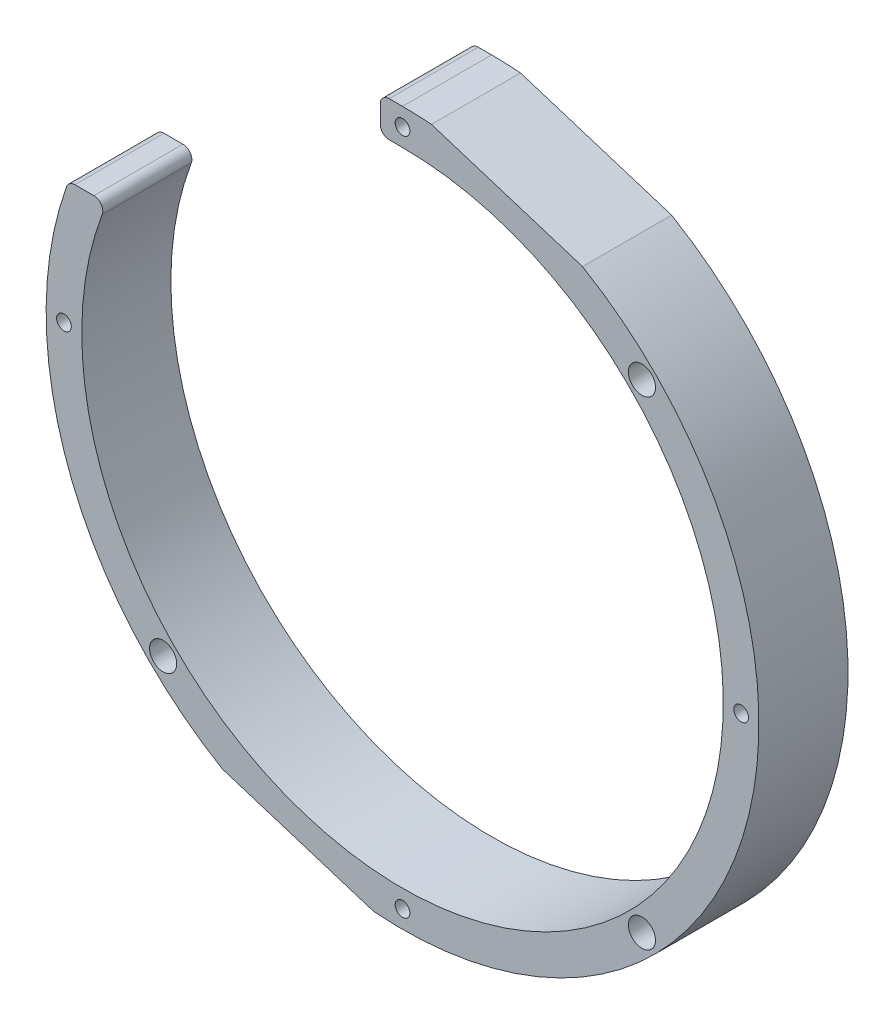
ISO-10303-21;
HEADER;
FILE_DESCRIPTION(('STEP AP214'),'2;1');
FILE_NAME('part.step','',(''),(''),'','','');
FILE_SCHEMA(('AUTOMOTIVE_DESIGN { 1 0 10303 214 1 1 1 1 }'));
ENDSEC;
DATA;
#1=APPLICATION_CONTEXT('core data for automotive mechanical design processes');
#2=APPLICATION_PROTOCOL_DEFINITION('international standard','automotive_design',2000,#1);
#3=PRODUCT_CONTEXT('',#1,'mechanical');
#4=PRODUCT('Part','Part','',(#3));
#5=PRODUCT_RELATED_PRODUCT_CATEGORY('part','',(#4));
#6=PRODUCT_DEFINITION_FORMATION('','',#4);
#7=PRODUCT_DEFINITION_CONTEXT('part definition',#1,'design');
#8=PRODUCT_DEFINITION('design','',#6,#7);
#9=PRODUCT_DEFINITION_SHAPE('','',#8);
#10=(LENGTH_UNIT() NAMED_UNIT(*) SI_UNIT(.MILLI.,.METRE.));
#11=(NAMED_UNIT(*) PLANE_ANGLE_UNIT() SI_UNIT($,.RADIAN.));
#12=(NAMED_UNIT(*) SI_UNIT($,.STERADIAN.) SOLID_ANGLE_UNIT());
#13=UNCERTAINTY_MEASURE_WITH_UNIT(LENGTH_MEASURE(1.E-05),#10,'distance_accuracy_value','');
#14=(GEOMETRIC_REPRESENTATION_CONTEXT(3) GLOBAL_UNCERTAINTY_ASSIGNED_CONTEXT((#13)) GLOBAL_UNIT_ASSIGNED_CONTEXT((#10,
#11,#12)) REPRESENTATION_CONTEXT('',''));
#15=CARTESIAN_POINT('',(0.,0.,0.));
#16=DIRECTION('',(0.,0.,1.));
#17=DIRECTION('',(1.,0.,0.));
#18=AXIS2_PLACEMENT_3D('',#15,#16,#17);
#19=CARTESIAN_POINT('',(0.,0.,20.));
#20=DIRECTION('',(0.,0.,-1.));
#21=DIRECTION('',(-1.,0.,0.));
#22=AXIS2_PLACEMENT_3D('',#19,#20,#21);
#23=CYLINDRICAL_SURFACE('',#22,80.);
#24=CARTESIAN_POINT('',(0.,0.,20.));
#25=DIRECTION('',(0.,0.,1.));
#26=DIRECTION('',(1.,0.,0.));
#27=AXIS2_PLACEMENT_3D('',#24,#25,#26);
#28=CIRCLE('',#27,80.);
#29=CARTESIAN_POINT('',(-6.48259589782646,-79.7369171113699,20.));
#30=VERTEX_POINT('',#29);
#31=CARTESIAN_POINT('',(40.3924041021735,69.0539911290196,20.));
#32=VERTEX_POINT('',#31);
#33=EDGE_CURVE('E154',#30,#32,#28,.T.);
#34=ORIENTED_EDGE('',*,*,#33,.F.);
#35=DIRECTION('',(0.,0.,-1.));
#36=VECTOR('',#35,1.);
#37=CARTESIAN_POINT('',(-6.48259589782646,-79.7369171113699,20.));
#38=LINE('',#37,#36);
#39=CARTESIAN_POINT('',(-6.48259589782646,-79.7369171113699,0.));
#40=VERTEX_POINT('',#39);
#41=EDGE_CURVE('E11',#30,#40,#38,.T.);
#42=ORIENTED_EDGE('',*,*,#41,.T.);
#43=CARTESIAN_POINT('',(0.,0.,0.));
#44=DIRECTION('',(0.,0.,1.));
#45=DIRECTION('',(1.,0.,0.));
#46=AXIS2_PLACEMENT_3D('',#43,#44,#45);
#47=CIRCLE('',#46,80.);
#48=CARTESIAN_POINT('',(40.3924041021735,69.0539911290196,0.));
#49=VERTEX_POINT('',#48);
#50=EDGE_CURVE('E164',#40,#49,#47,.T.);
#51=ORIENTED_EDGE('',*,*,#50,.T.);
#52=DIRECTION('',(0.,0.,-1.));
#53=VECTOR('',#52,1.);
#54=CARTESIAN_POINT('',(40.3924041021735,69.0539911290196,20.));
#55=LINE('',#54,#53);
#56=EDGE_CURVE('E144',#49,#32,#55,.F.);
#57=ORIENTED_EDGE('',*,*,#56,.T.);
#58=EDGE_LOOP('',(#34,#42,#51,#57));
#59=FACE_BOUND('',#58,.T.);
#60=ADVANCED_FACE('F38',(#59),#23,.T.);
#61=CARTESIAN_POINT('',(6.48259589782654,79.7369171113699,20.));
#62=VERTEX_POINT('',#61);
#63=CARTESIAN_POINT('',(0.,80.,20.));
#64=VERTEX_POINT('',#63);
#65=EDGE_CURVE('E151',#62,#64,#28,.T.);
#66=ORIENTED_EDGE('',*,*,#65,.F.);
#67=DIRECTION('',(0.,0.,-1.));
#68=VECTOR('',#67,1.);
#69=CARTESIAN_POINT('',(6.48259589782654,79.7369171113699,20.));
#70=LINE('',#69,#68);
#71=CARTESIAN_POINT('',(6.48259589782659,79.7369171113699,0.));
#72=VERTEX_POINT('',#71);
#73=EDGE_CURVE('E137',#62,#72,#70,.T.);
#74=ORIENTED_EDGE('',*,*,#73,.T.);
#75=CARTESIAN_POINT('',(0.,80.,0.));
#76=VERTEX_POINT('',#75);
#77=EDGE_CURVE('E166',#72,#76,#47,.T.);
#78=ORIENTED_EDGE('',*,*,#77,.T.);
#79=DIRECTION('',(0.,0.,1.));
#80=VECTOR('',#79,1.);
#81=CARTESIAN_POINT('',(0.,80.,0.));
#82=LINE('',#81,#80);
#83=EDGE_CURVE('E159',#76,#64,#82,.T.);
#84=ORIENTED_EDGE('',*,*,#83,.T.);
#85=EDGE_LOOP('',(#66,#74,#78,#84));
#86=FACE_BOUND('',#85,.T.);
#87=ADVANCED_FACE('F157',(#86),#23,.T.);
#88=CARTESIAN_POINT('',(0.,0.,20.));
#89=DIRECTION('',(0.,0.,1.));
#90=DIRECTION('',(1.,0.,0.));
#91=AXIS2_PLACEMENT_3D('',#88,#89,#90);
#92=PLANE('',#91);
#93=DIRECTION('',(-0.95378787333583,0.30048076923077,0.));
#94=VECTOR('',#93,1.);
#95=CARTESIAN_POINT('',(6.86909386117425,-83.9432255804466,20.));
#96=LINE('',#95,#94);
#97=CARTESIAN_POINT('',(-40.3924041021737,-69.0539911290195,20.));
#98=VERTEX_POINT('',#97);
#99=EDGE_CURVE('E61',#30,#98,#96,.T.);
#100=ORIENTED_EDGE('',*,*,#99,.F.);
#101=ORIENTED_EDGE('',*,*,#33,.T.);
#102=DIRECTION('',(0.95378787333583,-0.300480769230769,0.));
#103=VECTOR('',#102,1.);
#104=CARTESIAN_POINT('',(-8.2717714259117,84.3851242933763,20.));
#105=LINE('',#104,#103);
#106=EDGE_CURVE('E53',#62,#32,#105,.T.);
#107=ORIENTED_EDGE('',*,*,#106,.F.);
#108=ORIENTED_EDGE('',*,*,#65,.T.);
#109=DIRECTION('',(-1.,0.,0.));
#110=VECTOR('',#109,1.);
#111=CARTESIAN_POINT('',(0.,80.,20.));
#112=LINE('',#111,#110);
#113=CARTESIAN_POINT('',(-3.,80.,20.));
#114=VERTEX_POINT('',#113);
#115=EDGE_CURVE('E250',#64,#114,#112,.T.);
#116=ORIENTED_EDGE('',*,*,#115,.T.);
#117=CARTESIAN_POINT('',(-3.,78.,20.));
#118=DIRECTION('',(0.,0.,1.));
#119=DIRECTION('',(1.,0.,0.));
#120=AXIS2_PLACEMENT_3D('',#117,#118,#119);
#121=CIRCLE('',#120,2.);
#122=CARTESIAN_POINT('',(-5.,78.,20.));
#123=VERTEX_POINT('',#122);
#124=EDGE_CURVE('E195',#114,#123,#121,.T.);
#125=ORIENTED_EDGE('',*,*,#124,.T.);
#126=DIRECTION('',(0.,-1.,0.));
#127=VECTOR('',#126,1.);
#128=CARTESIAN_POINT('',(-5.,72.,20.));
#129=LINE('',#128,#127);
#130=CARTESIAN_POINT('',(-5.,74.,20.));
#131=VERTEX_POINT('',#130);
#132=EDGE_CURVE('E280',#123,#131,#129,.T.);
#133=ORIENTED_EDGE('',*,*,#132,.T.);
#134=CARTESIAN_POINT('',(-3.,74.,20.));
#135=DIRECTION('',(0.,0.,1.));
#136=DIRECTION('',(1.,0.,0.));
#137=AXIS2_PLACEMENT_3D('',#134,#135,#136);
#138=CIRCLE('',#137,2.);
#139=CARTESIAN_POINT('',(-3.,72.,20.));
#140=VERTEX_POINT('',#139);
#141=EDGE_CURVE('E193',#131,#140,#138,.T.);
#142=ORIENTED_EDGE('',*,*,#141,.T.);
#143=DIRECTION('',(1.,0.,0.));
#144=VECTOR('',#143,1.);
#145=CARTESIAN_POINT('',(-2.51386656396706E-13,72.,20.));
#146=LINE('',#145,#144);
#147=CARTESIAN_POINT('',(-2.51386656396706E-13,72.,20.));
#148=VERTEX_POINT('',#147);
#149=EDGE_CURVE('E275',#140,#148,#146,.T.);
#150=ORIENTED_EDGE('',*,*,#149,.T.);
#151=CARTESIAN_POINT('',(0.,0.,20.));
#152=DIRECTION('',(0.,0.,1.));
#153=DIRECTION('',(1.,0.,0.));
#154=AXIS2_PLACEMENT_3D('',#151,#152,#153);
#155=CIRCLE('',#154,72.);
#156=CARTESIAN_POINT('',(-67.4095449432212,25.2972972972973,20.));
#157=VERTEX_POINT('',#156);
#158=EDGE_CURVE('E294',#157,#148,#155,.T.);
#159=ORIENTED_EDGE('',*,*,#158,.F.);
#160=CARTESIAN_POINT('',(-69.2820323027551,26.,20.));
#161=DIRECTION('',(0.,0.,1.));
#162=DIRECTION('',(1.,0.,0.));
#163=AXIS2_PLACEMENT_3D('',#160,#161,#162);
#164=CIRCLE('',#163,2.);
#165=CARTESIAN_POINT('',(-69.2820323027551,28.,20.));
#166=VERTEX_POINT('',#165);
#167=EDGE_CURVE('E199',#157,#166,#164,.T.);
#168=ORIENTED_EDGE('',*,*,#167,.T.);
#169=DIRECTION('',(1.,0.,0.));
#170=VECTOR('',#169,1.);
#171=CARTESIAN_POINT('',(0.,28.,20.));
#172=LINE('',#171,#170);
#173=CARTESIAN_POINT('',(-73.5391052434009,28.,20.));
#174=VERTEX_POINT('',#173);
#175=EDGE_CURVE('E286',#174,#166,#172,.T.);
#176=ORIENTED_EDGE('',*,*,#175,.F.);
#177=CARTESIAN_POINT('',(-73.5391052434009,26.,20.));
#178=DIRECTION('',(0.,0.,1.));
#179=DIRECTION('',(1.,0.,0.));
#180=AXIS2_PLACEMENT_3D('',#177,#178,#179);
#181=CIRCLE('',#180,2.);
#182=CARTESIAN_POINT('',(-75.4247233265651,26.6666666666666,20.));
#183=VERTEX_POINT('',#182);
#184=EDGE_CURVE('E197',#174,#183,#181,.T.);
#185=ORIENTED_EDGE('',*,*,#184,.T.);
#186=EDGE_CURVE('E162',#183,#98,#28,.T.);
#187=ORIENTED_EDGE('',*,*,#186,.T.);
#188=EDGE_LOOP('',(#100,#101,#107,#108,#116,#125,#133,#142,#150,#159,#168,#176,#185,#187));
#189=FACE_BOUND('',#188,.T.);
#190=CARTESIAN_POINT('',(53.7401153701777,53.7401153701775,20.));
#191=DIRECTION('',(0.,0.,1.));
#192=DIRECTION('',(1.,0.,0.));
#193=AXIS2_PLACEMENT_3D('',#190,#191,#192);
#194=CIRCLE('',#193,3.05);
#195=CARTESIAN_POINT('',(56.7901153701777,53.7401153701775,20.));
#196=VERTEX_POINT('',#195);
#197=EDGE_CURVE('E218',#196,#196,#194,.T.);
#198=ORIENTED_EDGE('',*,*,#197,.F.);
#199=EDGE_LOOP('',(#198));
#200=FACE_BOUND('',#199,.T.);
#201=CARTESIAN_POINT('',(53.7401153701773,-53.7401153701779,20.));
#202=DIRECTION('',(0.,0.,1.));
#203=DIRECTION('',(1.,0.,0.));
#204=AXIS2_PLACEMENT_3D('',#201,#202,#203);
#205=CIRCLE('',#204,3.04999999999999);
#206=CARTESIAN_POINT('',(56.7901153701773,-53.7401153701779,20.));
#207=VERTEX_POINT('',#206);
#208=EDGE_CURVE('E239',#207,#207,#205,.T.);
#209=ORIENTED_EDGE('',*,*,#208,.F.);
#210=EDGE_LOOP('',(#209));
#211=FACE_BOUND('',#210,.T.);
#212=CARTESIAN_POINT('',(-53.7401153701762,-53.740115370179,20.));
#213=DIRECTION('',(0.,0.,1.));
#214=DIRECTION('',(-1.,0.,0.));
#215=AXIS2_PLACEMENT_3D('',#212,#213,#214);
#216=CIRCLE('',#215,3.04999999999999);
#217=CARTESIAN_POINT('',(-56.7901153701762,-53.740115370179,20.));
#218=VERTEX_POINT('',#217);
#219=EDGE_CURVE('E236',#218,#218,#216,.T.);
#220=ORIENTED_EDGE('',*,*,#219,.F.);
#221=EDGE_LOOP('',(#220));
#222=FACE_BOUND('',#221,.T.);
#223=CARTESIAN_POINT('',(-76.0000000000001,-8.10674255934108E-13,20.));
#224=DIRECTION('',(0.,0.,1.));
#225=DIRECTION('',(1.,0.,0.));
#226=AXIS2_PLACEMENT_3D('',#223,#224,#225);
#227=CIRCLE('',#226,1.65);
#228=CARTESIAN_POINT('',(-74.3500000000001,-8.10674255934108E-13,20.));
#229=VERTEX_POINT('',#228);
#230=EDGE_CURVE('E251',#229,#229,#227,.T.);
#231=ORIENTED_EDGE('',*,*,#230,.F.);
#232=EDGE_LOOP('',(#231));
#233=FACE_BOUND('',#232,.T.);
#234=CARTESIAN_POINT('',(0.,-76.0000000000001,20.));
#235=DIRECTION('',(0.,0.,1.));
#236=DIRECTION('',(1.,0.,0.));
#237=AXIS2_PLACEMENT_3D('',#234,#235,#236);
#238=CIRCLE('',#237,1.65);
#239=CARTESIAN_POINT('',(1.65000000000008,-76.0000000000001,20.));
#240=VERTEX_POINT('',#239);
#241=EDGE_CURVE('E257',#240,#240,#238,.T.);
#242=ORIENTED_EDGE('',*,*,#241,.F.);
#243=EDGE_LOOP('',(#242));
#244=FACE_BOUND('',#243,.T.);
#245=CARTESIAN_POINT('',(76.0000000000001,3.34243238210584E-13,20.));
#246=DIRECTION('',(0.,0.,1.));
#247=DIRECTION('',(1.,0.,0.));
#248=AXIS2_PLACEMENT_3D('',#245,#246,#247);
#249=CIRCLE('',#248,1.65);
#250=CARTESIAN_POINT('',(77.65,3.34243238210584E-13,20.));
#251=VERTEX_POINT('',#250);
#252=EDGE_CURVE('E263',#251,#251,#249,.T.);
#253=ORIENTED_EDGE('',*,*,#252,.F.);
#254=EDGE_LOOP('',(#253));
#255=FACE_BOUND('',#254,.T.);
#256=CARTESIAN_POINT('',(-5.75070603216809E-13,76.0000000000001,20.));
#257=DIRECTION('',(0.,0.,1.));
#258=DIRECTION('',(1.,0.,0.));
#259=AXIS2_PLACEMENT_3D('',#256,#257,#258);
#260=CIRCLE('',#259,1.65);
#261=CARTESIAN_POINT('',(1.64999999999942,76.0000000000001,20.));
#262=VERTEX_POINT('',#261);
#263=EDGE_CURVE('E224',#262,#262,#260,.T.);
#264=ORIENTED_EDGE('',*,*,#263,.F.);
#265=EDGE_LOOP('',(#264));
#266=FACE_BOUND('',#265,.T.);
#267=ADVANCED_FACE('F148',(#189,#200,#211,#222,#233,#244,#255,#266),#92,.T.);
#268=CARTESIAN_POINT('',(0.,0.,0.));
#269=DIRECTION('',(0.,0.,1.));
#270=DIRECTION('',(1.,0.,0.));
#271=AXIS2_PLACEMENT_3D('',#268,#269,#270);
#272=PLANE('',#271);
#273=CARTESIAN_POINT('',(53.7401153701777,53.7401153701775,0.));
#274=DIRECTION('',(0.,0.,1.));
#275=DIRECTION('',(1.,0.,0.));
#276=AXIS2_PLACEMENT_3D('',#273,#274,#275);
#277=CIRCLE('',#276,3.05);
#278=CARTESIAN_POINT('',(56.7901153701777,53.7401153701775,0.));
#279=VERTEX_POINT('',#278);
#280=EDGE_CURVE('E221',#279,#279,#277,.T.);
#281=ORIENTED_EDGE('',*,*,#280,.T.);
#282=EDGE_LOOP('',(#281));
#283=FACE_BOUND('',#282,.T.);
#284=CARTESIAN_POINT('',(53.7401153701773,-53.7401153701779,0.));
#285=DIRECTION('',(0.,0.,1.));
#286=DIRECTION('',(1.,0.,0.));
#287=AXIS2_PLACEMENT_3D('',#284,#285,#286);
#288=CIRCLE('',#287,3.04999999999999);
#289=CARTESIAN_POINT('',(56.7901153701773,-53.7401153701779,0.));
#290=VERTEX_POINT('',#289);
#291=EDGE_CURVE('E217',#290,#290,#288,.T.);
#292=ORIENTED_EDGE('',*,*,#291,.T.);
#293=EDGE_LOOP('',(#292));
#294=FACE_BOUND('',#293,.T.);
#295=CARTESIAN_POINT('',(-53.7401153701762,-53.740115370179,0.));
#296=DIRECTION('',(0.,0.,1.));
#297=DIRECTION('',(1.,0.,0.));
#298=AXIS2_PLACEMENT_3D('',#295,#296,#297);
#299=CIRCLE('',#298,3.04999999999999);
#300=CARTESIAN_POINT('',(-50.6901153701762,-53.740115370179,0.));
#301=VERTEX_POINT('',#300);
#302=EDGE_CURVE('E214',#301,#301,#299,.T.);
#303=ORIENTED_EDGE('',*,*,#302,.T.);
#304=EDGE_LOOP('',(#303));
#305=FACE_BOUND('',#304,.T.);
#306=CARTESIAN_POINT('',(-76.0000000000001,-8.10674255934108E-13,0.));
#307=DIRECTION('',(0.,0.,1.));
#308=DIRECTION('',(1.,0.,0.));
#309=AXIS2_PLACEMENT_3D('',#306,#307,#308);
#310=CIRCLE('',#309,1.65);
#311=CARTESIAN_POINT('',(-74.3500000000001,-8.10674255934108E-13,0.));
#312=VERTEX_POINT('',#311);
#313=EDGE_CURVE('E247',#312,#312,#310,.T.);
#314=ORIENTED_EDGE('',*,*,#313,.T.);
#315=EDGE_LOOP('',(#314));
#316=FACE_BOUND('',#315,.T.);
#317=CARTESIAN_POINT('',(0.,-76.0000000000001,0.));
#318=DIRECTION('',(0.,0.,1.));
#319=DIRECTION('',(1.,0.,0.));
#320=AXIS2_PLACEMENT_3D('',#317,#318,#319);
#321=CIRCLE('',#320,1.65);
#322=CARTESIAN_POINT('',(1.65000000000008,-76.0000000000001,0.));
#323=VERTEX_POINT('',#322);
#324=EDGE_CURVE('E254',#323,#323,#321,.T.);
#325=ORIENTED_EDGE('',*,*,#324,.T.);
#326=EDGE_LOOP('',(#325));
#327=FACE_BOUND('',#326,.T.);
#328=CARTESIAN_POINT('',(76.0000000000001,3.34243238210584E-13,0.));
#329=DIRECTION('',(0.,0.,1.));
#330=DIRECTION('',(1.,0.,0.));
#331=AXIS2_PLACEMENT_3D('',#328,#329,#330);
#332=CIRCLE('',#331,1.65);
#333=CARTESIAN_POINT('',(77.65,3.34243238210584E-13,0.));
#334=VERTEX_POINT('',#333);
#335=EDGE_CURVE('E260',#334,#334,#332,.T.);
#336=ORIENTED_EDGE('',*,*,#335,.T.);
#337=EDGE_LOOP('',(#336));
#338=FACE_BOUND('',#337,.T.);
#339=CARTESIAN_POINT('',(-5.75070603216809E-13,76.0000000000001,0.));
#340=DIRECTION('',(0.,0.,1.));
#341=DIRECTION('',(1.,0.,0.));
#342=AXIS2_PLACEMENT_3D('',#339,#340,#341);
#343=CIRCLE('',#342,1.65);
#344=CARTESIAN_POINT('',(1.64999999999942,76.0000000000001,0.));
#345=VERTEX_POINT('',#344);
#346=EDGE_CURVE('E266',#345,#345,#343,.T.);
#347=ORIENTED_EDGE('',*,*,#346,.T.);
#348=EDGE_LOOP('',(#347));
#349=FACE_BOUND('',#348,.T.);
#350=ORIENTED_EDGE('',*,*,#50,.F.);
#351=DIRECTION('',(-0.95378787333583,0.30048076923077,0.));
#352=VECTOR('',#351,1.);
#353=CARTESIAN_POINT('',(-23.4375000000001,-74.3954541201947,0.));
#354=LINE('',#353,#352);
#355=CARTESIAN_POINT('',(-40.3924041021736,-69.0539911290195,0.));
#356=VERTEX_POINT('',#355);
#357=EDGE_CURVE('E231',#40,#356,#354,.T.);
#358=ORIENTED_EDGE('',*,*,#357,.T.);
#359=CARTESIAN_POINT('',(-75.4247233265651,26.6666666666666,0.));
#360=VERTEX_POINT('',#359);
#361=EDGE_CURVE('E160',#360,#356,#47,.T.);
#362=ORIENTED_EDGE('',*,*,#361,.F.);
#363=CARTESIAN_POINT('',(-73.5391052434009,26.,0.));
#364=DIRECTION('',(0.,0.,1.));
#365=DIRECTION('',(1.,0.,0.));
#366=AXIS2_PLACEMENT_3D('',#363,#364,#365);
#367=CIRCLE('',#366,2.);
#368=CARTESIAN_POINT('',(-73.5391052434009,28.,0.));
#369=VERTEX_POINT('',#368);
#370=EDGE_CURVE('E187',#360,#369,#367,.F.);
#371=ORIENTED_EDGE('',*,*,#370,.T.);
#372=DIRECTION('',(1.,0.,0.));
#373=VECTOR('',#372,1.);
#374=CARTESIAN_POINT('',(0.,28.,0.));
#375=LINE('',#374,#373);
#376=CARTESIAN_POINT('',(-69.2820323027551,28.,0.));
#377=VERTEX_POINT('',#376);
#378=EDGE_CURVE('E287',#369,#377,#375,.T.);
#379=ORIENTED_EDGE('',*,*,#378,.T.);
#380=CARTESIAN_POINT('',(-69.2820323027551,26.,0.));
#381=DIRECTION('',(0.,0.,1.));
#382=DIRECTION('',(1.,0.,0.));
#383=AXIS2_PLACEMENT_3D('',#380,#381,#382);
#384=CIRCLE('',#383,2.);
#385=CARTESIAN_POINT('',(-67.4095449432212,25.2972972972973,0.));
#386=VERTEX_POINT('',#385);
#387=EDGE_CURVE('E189',#377,#386,#384,.F.);
#388=ORIENTED_EDGE('',*,*,#387,.T.);
#389=CARTESIAN_POINT('',(0.,0.,0.));
#390=DIRECTION('',(0.,0.,1.));
#391=DIRECTION('',(1.,0.,0.));
#392=AXIS2_PLACEMENT_3D('',#389,#390,#391);
#393=CIRCLE('',#392,72.);
#394=CARTESIAN_POINT('',(-2.51386656396706E-13,72.,0.));
#395=VERTEX_POINT('',#394);
#396=EDGE_CURVE('E293',#386,#395,#393,.T.);
#397=ORIENTED_EDGE('',*,*,#396,.T.);
#398=DIRECTION('',(-1.,0.,0.));
#399=VECTOR('',#398,1.);
#400=CARTESIAN_POINT('',(-2.51386656396706E-13,72.,0.));
#401=LINE('',#400,#399);
#402=CARTESIAN_POINT('',(-3.,72.,0.));
#403=VERTEX_POINT('',#402);
#404=EDGE_CURVE('E274',#395,#403,#401,.T.);
#405=ORIENTED_EDGE('',*,*,#404,.T.);
#406=CARTESIAN_POINT('',(-3.,74.,0.));
#407=DIRECTION('',(0.,0.,1.));
#408=DIRECTION('',(1.,0.,0.));
#409=AXIS2_PLACEMENT_3D('',#406,#407,#408);
#410=CIRCLE('',#409,2.);
#411=CARTESIAN_POINT('',(-5.,74.,0.));
#412=VERTEX_POINT('',#411);
#413=EDGE_CURVE('E183',#403,#412,#410,.F.);
#414=ORIENTED_EDGE('',*,*,#413,.T.);
#415=DIRECTION('',(0.,1.,0.));
#416=VECTOR('',#415,1.);
#417=CARTESIAN_POINT('',(-5.,72.,0.));
#418=LINE('',#417,#416);
#419=CARTESIAN_POINT('',(-5.,78.,0.));
#420=VERTEX_POINT('',#419);
#421=EDGE_CURVE('E271',#412,#420,#418,.T.);
#422=ORIENTED_EDGE('',*,*,#421,.T.);
#423=CARTESIAN_POINT('',(-3.,78.,0.));
#424=DIRECTION('',(0.,0.,1.));
#425=DIRECTION('',(1.,0.,0.));
#426=AXIS2_PLACEMENT_3D('',#423,#424,#425);
#427=CIRCLE('',#426,2.);
#428=CARTESIAN_POINT('',(-3.,80.,0.));
#429=VERTEX_POINT('',#428);
#430=EDGE_CURVE('E185',#420,#429,#427,.F.);
#431=ORIENTED_EDGE('',*,*,#430,.T.);
#432=DIRECTION('',(1.,0.,0.));
#433=VECTOR('',#432,1.);
#434=CARTESIAN_POINT('',(0.,80.,0.));
#435=LINE('',#434,#433);
#436=EDGE_CURVE('E278',#429,#76,#435,.T.);
#437=ORIENTED_EDGE('',*,*,#436,.T.);
#438=ORIENTED_EDGE('',*,*,#77,.F.);
#439=DIRECTION('',(0.95378787333583,-0.300480769230769,0.));
#440=VECTOR('',#439,1.);
#441=CARTESIAN_POINT('',(23.4375,74.3954541201948,0.));
#442=LINE('',#441,#440);
#443=EDGE_CURVE('E140',#72,#49,#442,.T.);
#444=ORIENTED_EDGE('',*,*,#443,.T.);
#445=EDGE_LOOP('',(#350,#358,#362,#371,#379,#388,#397,#405,#414,#422,#431,#437,#438,#444));
#446=FACE_BOUND('',#445,.T.);
#447=ADVANCED_FACE('F234',(#283,#294,#305,#316,#327,#338,#349,#446),#272,.F.);
#448=ORIENTED_EDGE('',*,*,#361,.T.);
#449=DIRECTION('',(0.,0.,-1.));
#450=VECTOR('',#449,1.);
#451=CARTESIAN_POINT('',(-40.3924041021736,-69.0539911290195,20.));
#452=LINE('',#451,#450);
#453=EDGE_CURVE('E46',#356,#98,#452,.F.);
#454=ORIENTED_EDGE('',*,*,#453,.T.);
#455=ORIENTED_EDGE('',*,*,#186,.F.);
#456=DIRECTION('',(0.,0.,-1.));
#457=VECTOR('',#456,1.);
#458=CARTESIAN_POINT('',(-75.4247233265651,26.6666666666666,20.));
#459=LINE('',#458,#457);
#460=EDGE_CURVE('E201',#183,#360,#459,.T.);
#461=ORIENTED_EDGE('',*,*,#460,.T.);
#462=EDGE_LOOP('',(#448,#454,#455,#461));
#463=FACE_BOUND('',#462,.T.);
#464=ADVANCED_FACE('F226',(#463),#23,.T.);
#465=CARTESIAN_POINT('',(0.,0.,20.));
#466=DIRECTION('',(0.,0.,-1.));
#467=DIRECTION('',(-1.,0.,0.));
#468=AXIS2_PLACEMENT_3D('',#465,#466,#467);
#469=CYLINDRICAL_SURFACE('',#468,72.);
#470=ORIENTED_EDGE('',*,*,#396,.F.);
#471=DIRECTION('',(0.,0.,-1.));
#472=VECTOR('',#471,1.);
#473=CARTESIAN_POINT('',(-67.4095449432212,25.2972972972973,20.));
#474=LINE('',#473,#472);
#475=EDGE_CURVE('E191',#386,#157,#474,.F.);
#476=ORIENTED_EDGE('',*,*,#475,.T.);
#477=ORIENTED_EDGE('',*,*,#158,.T.);
#478=DIRECTION('',(0.,0.,-1.));
#479=VECTOR('',#478,1.);
#480=CARTESIAN_POINT('',(0.,72.,20.));
#481=LINE('',#480,#479);
#482=EDGE_CURVE('E169',#395,#148,#481,.F.);
#483=ORIENTED_EDGE('',*,*,#482,.F.);
#484=EDGE_LOOP('',(#470,#476,#477,#483));
#485=FACE_BOUND('',#484,.T.);
#486=ADVANCED_FACE('F302',(#485),#469,.F.);
#487=CARTESIAN_POINT('',(0.,28.,0.));
#488=DIRECTION('',(0.,-1.,0.));
#489=DIRECTION('',(1.,0.,0.));
#490=AXIS2_PLACEMENT_3D('',#487,#488,#489);
#491=PLANE('',#490);
#492=ORIENTED_EDGE('',*,*,#175,.T.);
#493=DIRECTION('',(0.,0.,1.));
#494=VECTOR('',#493,1.);
#495=CARTESIAN_POINT('',(-69.2820323027551,28.,0.));
#496=LINE('',#495,#494);
#497=EDGE_CURVE('E178',#166,#377,#496,.F.);
#498=ORIENTED_EDGE('',*,*,#497,.T.);
#499=ORIENTED_EDGE('',*,*,#378,.F.);
#500=DIRECTION('',(0.,0.,-1.));
#501=VECTOR('',#500,1.);
#502=CARTESIAN_POINT('',(-73.5391052434009,28.,0.));
#503=LINE('',#502,#501);
#504=EDGE_CURVE('E172',#369,#174,#503,.F.);
#505=ORIENTED_EDGE('',*,*,#504,.T.);
#506=EDGE_LOOP('',(#492,#498,#499,#505));
#507=FACE_BOUND('',#506,.T.);
#508=ADVANCED_FACE('F311',(#507),#491,.F.);
#509=CARTESIAN_POINT('',(-2.51386656396706E-13,72.,-9.4339811320566));
#510=DIRECTION('',(0.,-1.,0.));
#511=DIRECTION('',(0.,0.,-1.));
#512=AXIS2_PLACEMENT_3D('',#509,#510,#511);
#513=PLANE('',#512);
#514=ORIENTED_EDGE('',*,*,#149,.F.);
#515=DIRECTION('',(0.,0.,1.));
#516=VECTOR('',#515,1.);
#517=CARTESIAN_POINT('',(-3.,72.,-9.4339811320566));
#518=LINE('',#517,#516);
#519=EDGE_CURVE('E212',#140,#403,#518,.F.);
#520=ORIENTED_EDGE('',*,*,#519,.T.);
#521=ORIENTED_EDGE('',*,*,#404,.F.);
#522=ORIENTED_EDGE('',*,*,#482,.T.);
#523=EDGE_LOOP('',(#514,#520,#521,#522));
#524=FACE_BOUND('',#523,.T.);
#525=ADVANCED_FACE('F300',(#524),#513,.T.);
#526=CARTESIAN_POINT('',(-5.,72.,-9.4339811320566));
#527=DIRECTION('',(-1.,0.,0.));
#528=DIRECTION('',(0.,-1.,0.));
#529=AXIS2_PLACEMENT_3D('',#526,#527,#528);
#530=PLANE('',#529);
#531=ORIENTED_EDGE('',*,*,#132,.F.);
#532=DIRECTION('',(0.,0.,1.));
#533=VECTOR('',#532,1.);
#534=CARTESIAN_POINT('',(-5.,78.,-9.4339811320566));
#535=LINE('',#534,#533);
#536=EDGE_CURVE('E210',#123,#420,#535,.F.);
#537=ORIENTED_EDGE('',*,*,#536,.T.);
#538=ORIENTED_EDGE('',*,*,#421,.F.);
#539=DIRECTION('',(0.,0.,1.));
#540=VECTOR('',#539,1.);
#541=CARTESIAN_POINT('',(-5.,74.,-9.4339811320566));
#542=LINE('',#541,#540);
#543=EDGE_CURVE('E207',#412,#131,#542,.T.);
#544=ORIENTED_EDGE('',*,*,#543,.T.);
#545=EDGE_LOOP('',(#531,#537,#538,#544));
#546=FACE_BOUND('',#545,.T.);
#547=ADVANCED_FACE('F350',(#546),#530,.T.);
#548=CARTESIAN_POINT('',(0.,80.,-9.4339811320566));
#549=DIRECTION('',(0.,1.,0.));
#550=DIRECTION('',(0.,0.,1.));
#551=AXIS2_PLACEMENT_3D('',#548,#549,#550);
#552=PLANE('',#551);
#553=ORIENTED_EDGE('',*,*,#436,.F.);
#554=DIRECTION('',(0.,0.,1.));
#555=VECTOR('',#554,1.);
#556=CARTESIAN_POINT('',(-3.,80.,-9.4339811320566));
#557=LINE('',#556,#555);
#558=EDGE_CURVE('E204',#429,#114,#557,.T.);
#559=ORIENTED_EDGE('',*,*,#558,.T.);
#560=ORIENTED_EDGE('',*,*,#115,.F.);
#561=ORIENTED_EDGE('',*,*,#83,.F.);
#562=EDGE_LOOP('',(#553,#559,#560,#561));
#563=FACE_BOUND('',#562,.T.);
#564=ADVANCED_FACE('F324',(#563),#552,.T.);
#565=CARTESIAN_POINT('',(-69.2820323027551,26.,20.));
#566=DIRECTION('',(0.,0.,-1.));
#567=DIRECTION('',(-1.,0.,0.));
#568=AXIS2_PLACEMENT_3D('',#565,#566,#567);
#569=CYLINDRICAL_SURFACE('',#568,2.);
#570=ORIENTED_EDGE('',*,*,#167,.F.);
#571=ORIENTED_EDGE('',*,*,#475,.F.);
#572=ORIENTED_EDGE('',*,*,#387,.F.);
#573=ORIENTED_EDGE('',*,*,#497,.F.);
#574=EDGE_LOOP('',(#570,#571,#572,#573));
#575=FACE_BOUND('',#574,.T.);
#576=ADVANCED_FACE('F308',(#575),#569,.T.);
#577=CARTESIAN_POINT('',(-73.5391052434009,26.,20.));
#578=DIRECTION('',(0.,0.,-1.));
#579=DIRECTION('',(-1.,0.,0.));
#580=AXIS2_PLACEMENT_3D('',#577,#578,#579);
#581=CYLINDRICAL_SURFACE('',#580,2.);
#582=ORIENTED_EDGE('',*,*,#184,.F.);
#583=ORIENTED_EDGE('',*,*,#504,.F.);
#584=ORIENTED_EDGE('',*,*,#370,.F.);
#585=ORIENTED_EDGE('',*,*,#460,.F.);
#586=EDGE_LOOP('',(#582,#583,#584,#585));
#587=FACE_BOUND('',#586,.T.);
#588=ADVANCED_FACE('F315',(#587),#581,.T.);
#589=CARTESIAN_POINT('',(-3.,78.,-9.4339811320566));
#590=DIRECTION('',(0.,0.,1.));
#591=DIRECTION('',(1.,0.,0.));
#592=AXIS2_PLACEMENT_3D('',#589,#590,#591);
#593=CYLINDRICAL_SURFACE('',#592,2.);
#594=ORIENTED_EDGE('',*,*,#430,.F.);
#595=ORIENTED_EDGE('',*,*,#536,.F.);
#596=ORIENTED_EDGE('',*,*,#124,.F.);
#597=ORIENTED_EDGE('',*,*,#558,.F.);
#598=EDGE_LOOP('',(#594,#595,#596,#597));
#599=FACE_BOUND('',#598,.T.);
#600=ADVANCED_FACE('F317',(#599),#593,.T.);
#601=CARTESIAN_POINT('',(-3.,74.,-9.4339811320566));
#602=DIRECTION('',(0.,0.,1.));
#603=DIRECTION('',(1.,0.,0.));
#604=AXIS2_PLACEMENT_3D('',#601,#602,#603);
#605=CYLINDRICAL_SURFACE('',#604,2.);
#606=ORIENTED_EDGE('',*,*,#413,.F.);
#607=ORIENTED_EDGE('',*,*,#519,.F.);
#608=ORIENTED_EDGE('',*,*,#141,.F.);
#609=ORIENTED_EDGE('',*,*,#543,.F.);
#610=EDGE_LOOP('',(#606,#607,#608,#609));
#611=FACE_BOUND('',#610,.T.);
#612=ADVANCED_FACE('F40',(#611),#605,.T.);
#613=CARTESIAN_POINT('',(-5.75070603216809E-13,76.0000000000001,0.));
#614=DIRECTION('',(0.,0.,1.));
#615=DIRECTION('',(1.,0.,0.));
#616=AXIS2_PLACEMENT_3D('',#613,#614,#615);
#617=CYLINDRICAL_SURFACE('',#616,1.65);
#618=ORIENTED_EDGE('',*,*,#346,.F.);
#619=EDGE_LOOP('',(#618));
#620=FACE_BOUND('',#619,.T.);
#621=ORIENTED_EDGE('',*,*,#263,.T.);
#622=EDGE_LOOP('',(#621));
#623=FACE_BOUND('',#622,.T.);
#624=ADVANCED_FACE('F357',(#620,#623),#617,.F.);
#625=CARTESIAN_POINT('',(76.0000000000001,3.34243238210584E-13,0.));
#626=DIRECTION('',(0.,0.,1.));
#627=DIRECTION('',(1.,0.,0.));
#628=AXIS2_PLACEMENT_3D('',#625,#626,#627);
#629=CYLINDRICAL_SURFACE('',#628,1.65);
#630=ORIENTED_EDGE('',*,*,#335,.F.);
#631=EDGE_LOOP('',(#630));
#632=FACE_BOUND('',#631,.T.);
#633=ORIENTED_EDGE('',*,*,#252,.T.);
#634=EDGE_LOOP('',(#633));
#635=FACE_BOUND('',#634,.T.);
#636=ADVANCED_FACE('F360',(#632,#635),#629,.F.);
#637=CARTESIAN_POINT('',(0.,-76.0000000000001,0.));
#638=DIRECTION('',(0.,0.,1.));
#639=DIRECTION('',(1.,0.,0.));
#640=AXIS2_PLACEMENT_3D('',#637,#638,#639);
#641=CYLINDRICAL_SURFACE('',#640,1.65);
#642=ORIENTED_EDGE('',*,*,#324,.F.);
#643=EDGE_LOOP('',(#642));
#644=FACE_BOUND('',#643,.T.);
#645=ORIENTED_EDGE('',*,*,#241,.T.);
#646=EDGE_LOOP('',(#645));
#647=FACE_BOUND('',#646,.T.);
#648=ADVANCED_FACE('F364',(#644,#647),#641,.F.);
#649=CARTESIAN_POINT('',(-76.0000000000001,-8.10674255934108E-13,0.));
#650=DIRECTION('',(0.,0.,1.));
#651=DIRECTION('',(1.,0.,0.));
#652=AXIS2_PLACEMENT_3D('',#649,#650,#651);
#653=CYLINDRICAL_SURFACE('',#652,1.65);
#654=ORIENTED_EDGE('',*,*,#313,.F.);
#655=EDGE_LOOP('',(#654));
#656=FACE_BOUND('',#655,.T.);
#657=ORIENTED_EDGE('',*,*,#230,.T.);
#658=EDGE_LOOP('',(#657));
#659=FACE_BOUND('',#658,.T.);
#660=ADVANCED_FACE('F368',(#656,#659),#653,.F.);
#661=CARTESIAN_POINT('',(-53.7401153701762,-53.740115370179,-10.));
#662=DIRECTION('',(0.,0.,1.));
#663=DIRECTION('',(1.,0.,0.));
#664=AXIS2_PLACEMENT_3D('',#661,#662,#663);
#665=CYLINDRICAL_SURFACE('',#664,3.04999999999999);
#666=ORIENTED_EDGE('',*,*,#219,.T.);
#667=EDGE_LOOP('',(#666));
#668=FACE_BOUND('',#667,.T.);
#669=ORIENTED_EDGE('',*,*,#302,.F.);
#670=EDGE_LOOP('',(#669));
#671=FACE_BOUND('',#670,.T.);
#672=ADVANCED_FACE('F372',(#668,#671),#665,.F.);
#673=CARTESIAN_POINT('',(53.7401153701773,-53.7401153701779,-10.));
#674=DIRECTION('',(0.,0.,1.));
#675=DIRECTION('',(1.,0.,0.));
#676=AXIS2_PLACEMENT_3D('',#673,#674,#675);
#677=CYLINDRICAL_SURFACE('',#676,3.04999999999999);
#678=ORIENTED_EDGE('',*,*,#208,.T.);
#679=EDGE_LOOP('',(#678));
#680=FACE_BOUND('',#679,.T.);
#681=ORIENTED_EDGE('',*,*,#291,.F.);
#682=EDGE_LOOP('',(#681));
#683=FACE_BOUND('',#682,.T.);
#684=ADVANCED_FACE('F376',(#680,#683),#677,.F.);
#685=CARTESIAN_POINT('',(53.7401153701777,53.7401153701775,-10.));
#686=DIRECTION('',(0.,0.,1.));
#687=DIRECTION('',(1.,0.,0.));
#688=AXIS2_PLACEMENT_3D('',#685,#686,#687);
#689=CYLINDRICAL_SURFACE('',#688,3.05);
#690=ORIENTED_EDGE('',*,*,#197,.T.);
#691=EDGE_LOOP('',(#690));
#692=FACE_BOUND('',#691,.T.);
#693=ORIENTED_EDGE('',*,*,#280,.F.);
#694=EDGE_LOOP('',(#693));
#695=FACE_BOUND('',#694,.T.);
#696=ADVANCED_FACE('F380',(#692,#695),#689,.F.);
#697=CARTESIAN_POINT('',(-8.2717714259117,84.3851242933763,-30.));
#698=DIRECTION('',(-0.300480769230769,-0.95378787333583,0.));
#699=DIRECTION('',(0.95378787333583,-0.300480769230769,0.));
#700=AXIS2_PLACEMENT_3D('',#697,#698,#699);
#701=PLANE('',#700);
#702=ORIENTED_EDGE('',*,*,#106,.T.);
#703=ORIENTED_EDGE('',*,*,#56,.F.);
#704=ORIENTED_EDGE('',*,*,#443,.F.);
#705=ORIENTED_EDGE('',*,*,#73,.F.);
#706=EDGE_LOOP('',(#702,#703,#704,#705));
#707=FACE_BOUND('',#706,.T.);
#708=ADVANCED_FACE('F138',(#707),#701,.F.);
#709=CARTESIAN_POINT('',(6.86909386117425,-83.9432255804466,-30.));
#710=DIRECTION('',(0.30048076923077,0.95378787333583,0.));
#711=DIRECTION('',(-0.95378787333583,0.30048076923077,0.));
#712=AXIS2_PLACEMENT_3D('',#709,#710,#711);
#713=PLANE('',#712);
#714=ORIENTED_EDGE('',*,*,#99,.T.);
#715=ORIENTED_EDGE('',*,*,#453,.F.);
#716=ORIENTED_EDGE('',*,*,#357,.F.);
#717=ORIENTED_EDGE('',*,*,#41,.F.);
#718=EDGE_LOOP('',(#714,#715,#716,#717));
#719=FACE_BOUND('',#718,.T.);
#720=ADVANCED_FACE('F230',(#719),#713,.F.);
#721=CLOSED_SHELL('',(#60,#87,#267,#447,#464,#486,#508,#525,#547,#564,#576,#588,#600,#612,#624,
#636,#648,#660,#672,#684,#696,#708,#720));
#722=MANIFOLD_SOLID_BREP('B2',#721);
#723=ADVANCED_BREP_SHAPE_REPRESENTATION('',(#18,#722),#14);
#724=SHAPE_DEFINITION_REPRESENTATION(#9,#723);
ENDSEC;
END-ISO-10303-21;
